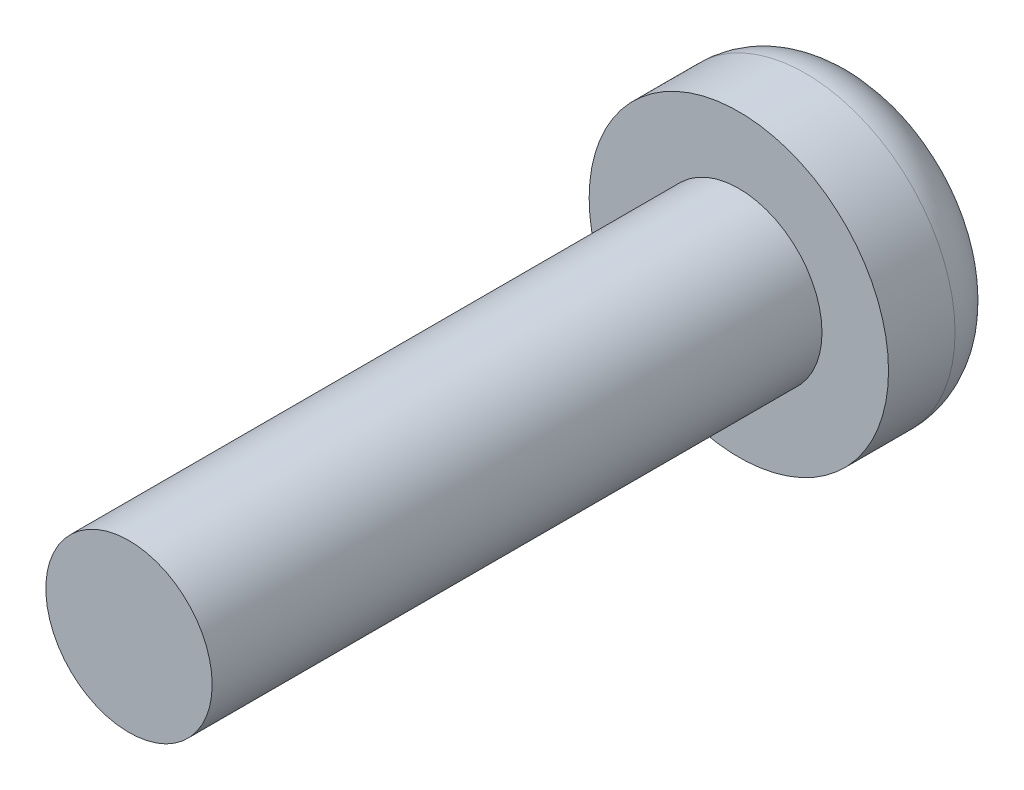
ISO-10303-21;
HEADER;
FILE_DESCRIPTION(('STEP AP214'),'2;1');
FILE_NAME('part.step','',(''),(''),'','','');
FILE_SCHEMA(('AUTOMOTIVE_DESIGN { 1 0 10303 214 1 1 1 1 }'));
ENDSEC;
DATA;
#1=APPLICATION_CONTEXT('core data for automotive mechanical design processes');
#2=APPLICATION_PROTOCOL_DEFINITION('international standard','automotive_design',2000,#1);
#3=PRODUCT_CONTEXT('',#1,'mechanical');
#4=PRODUCT('Part','Part','',(#3));
#5=PRODUCT_RELATED_PRODUCT_CATEGORY('part','',(#4));
#6=PRODUCT_DEFINITION_FORMATION('','',#4);
#7=PRODUCT_DEFINITION_CONTEXT('part definition',#1,'design');
#8=PRODUCT_DEFINITION('design','',#6,#7);
#9=PRODUCT_DEFINITION_SHAPE('','',#8);
#10=(LENGTH_UNIT() NAMED_UNIT(*) SI_UNIT(.MILLI.,.METRE.));
#11=(NAMED_UNIT(*) PLANE_ANGLE_UNIT() SI_UNIT($,.RADIAN.));
#12=(NAMED_UNIT(*) SI_UNIT($,.STERADIAN.) SOLID_ANGLE_UNIT());
#13=UNCERTAINTY_MEASURE_WITH_UNIT(LENGTH_MEASURE(1.E-05),#10,'distance_accuracy_value','');
#14=(GEOMETRIC_REPRESENTATION_CONTEXT(3) GLOBAL_UNCERTAINTY_ASSIGNED_CONTEXT((#13)) GLOBAL_UNIT_ASSIGNED_CONTEXT((#10,
#11,#12)) REPRESENTATION_CONTEXT('',''));
#15=CARTESIAN_POINT('',(0.,0.,0.));
#16=DIRECTION('',(0.,0.,1.));
#17=DIRECTION('',(1.,0.,0.));
#18=AXIS2_PLACEMENT_3D('',#15,#16,#17);
#19=CARTESIAN_POINT('',(0.,0.,11.));
#20=DIRECTION('',(0.,0.,-1.));
#21=DIRECTION('',(-1.,0.,0.));
#22=AXIS2_PLACEMENT_3D('',#19,#20,#21);
#23=CYLINDRICAL_SURFACE('',#22,1.5);
#24=CARTESIAN_POINT('',(0.,0.,11.));
#25=DIRECTION('',(0.,0.,1.));
#26=DIRECTION('',(1.,0.,0.));
#27=AXIS2_PLACEMENT_3D('',#24,#25,#26);
#28=CIRCLE('',#27,1.5);
#29=CARTESIAN_POINT('',(1.5,0.,11.));
#30=VERTEX_POINT('',#29);
#31=EDGE_CURVE('E50',#30,#30,#28,.T.);
#32=ORIENTED_EDGE('',*,*,#31,.F.);
#33=EDGE_LOOP('',(#32));
#34=FACE_BOUND('',#33,.T.);
#35=CARTESIAN_POINT('',(0.,0.,0.));
#36=DIRECTION('',(0.,0.,1.));
#37=DIRECTION('',(1.,0.,0.));
#38=AXIS2_PLACEMENT_3D('',#35,#36,#37);
#39=CIRCLE('',#38,1.5);
#40=CARTESIAN_POINT('',(1.5,0.,0.));
#41=VERTEX_POINT('',#40);
#42=EDGE_CURVE('E55',#41,#41,#39,.T.);
#43=ORIENTED_EDGE('',*,*,#42,.T.);
#44=EDGE_LOOP('',(#43));
#45=FACE_BOUND('',#44,.T.);
#46=ADVANCED_FACE('F37',(#34,#45),#23,.T.);
#47=CARTESIAN_POINT('',(0.,0.,11.));
#48=DIRECTION('',(0.,0.,1.));
#49=DIRECTION('',(1.,0.,0.));
#50=AXIS2_PLACEMENT_3D('',#47,#48,#49);
#51=PLANE('',#50);
#52=ORIENTED_EDGE('',*,*,#31,.T.);
#53=EDGE_LOOP('',(#52));
#54=FACE_BOUND('',#53,.T.);
#55=ADVANCED_FACE('F82',(#54),#51,.T.);
#56=CARTESIAN_POINT('',(0.,0.,-2.2));
#57=DIRECTION('',(0.,0.,1.));
#58=DIRECTION('',(1.,0.,0.));
#59=AXIS2_PLACEMENT_3D('',#56,#57,#58);
#60=CYLINDRICAL_SURFACE('',#59,2.7);
#61=CARTESIAN_POINT('',(0.,0.,-1.2));
#62=DIRECTION('',(0.,0.,-1.));
#63=DIRECTION('',(-1.,0.,0.));
#64=AXIS2_PLACEMENT_3D('',#61,#62,#63);
#65=CIRCLE('',#64,2.7);
#66=CARTESIAN_POINT('',(-2.7,0.,-1.2));
#67=VERTEX_POINT('',#66);
#68=EDGE_CURVE('E10',#67,#67,#65,.F.);
#69=ORIENTED_EDGE('',*,*,#68,.T.);
#70=EDGE_LOOP('',(#69));
#71=FACE_BOUND('',#70,.T.);
#72=CARTESIAN_POINT('',(0.,0.,0.));
#73=DIRECTION('',(0.,0.,-1.));
#74=DIRECTION('',(-1.,0.,0.));
#75=AXIS2_PLACEMENT_3D('',#72,#73,#74);
#76=CIRCLE('',#75,2.7);
#77=CARTESIAN_POINT('',(-2.7,0.,0.));
#78=VERTEX_POINT('',#77);
#79=EDGE_CURVE('E60',#78,#78,#76,.T.);
#80=ORIENTED_EDGE('',*,*,#79,.T.);
#81=EDGE_LOOP('',(#80));
#82=FACE_BOUND('',#81,.T.);
#83=ADVANCED_FACE('F66',(#71,#82),#60,.T.);
#84=CARTESIAN_POINT('',(0.,0.,-2.2));
#85=DIRECTION('',(0.,0.,-1.));
#86=DIRECTION('',(-1.,0.,0.));
#87=AXIS2_PLACEMENT_3D('',#84,#85,#86);
#88=PLANE('',#87);
#89=CARTESIAN_POINT('',(0.,0.,-2.2));
#90=DIRECTION('',(0.,0.,-1.));
#91=DIRECTION('',(-1.,0.,0.));
#92=AXIS2_PLACEMENT_3D('',#89,#90,#91);
#93=CIRCLE('',#92,1.7);
#94=CARTESIAN_POINT('',(-1.7,0.,-2.2));
#95=VERTEX_POINT('',#94);
#96=EDGE_CURVE('E45',#95,#95,#93,.T.);
#97=ORIENTED_EDGE('',*,*,#96,.T.);
#98=EDGE_LOOP('',(#97));
#99=FACE_BOUND('',#98,.T.);
#100=ADVANCED_FACE('F70',(#99),#88,.T.);
#101=CARTESIAN_POINT('',(0.,0.,0.));
#102=DIRECTION('',(0.,0.,-1.));
#103=DIRECTION('',(-1.,0.,0.));
#104=AXIS2_PLACEMENT_3D('',#101,#102,#103);
#105=PLANE('',#104);
#106=ORIENTED_EDGE('',*,*,#42,.F.);
#107=EDGE_LOOP('',(#106));
#108=FACE_BOUND('',#107,.T.);
#109=ORIENTED_EDGE('',*,*,#79,.F.);
#110=EDGE_LOOP('',(#109));
#111=FACE_BOUND('',#110,.T.);
#112=ADVANCED_FACE('F68',(#108,#111),#105,.F.);
#113=CARTESIAN_POINT('',(0.,0.,-1.2));
#114=DIRECTION('',(0.,0.,-1.));
#115=DIRECTION('',(-1.,0.,0.));
#116=AXIS2_PLACEMENT_3D('',#113,#114,#115);
#117=TOROIDAL_SURFACE('',#116,1.7,1.);
#118=ORIENTED_EDGE('',*,*,#68,.F.);
#119=EDGE_LOOP('',(#118));
#120=FACE_BOUND('',#119,.T.);
#121=ORIENTED_EDGE('',*,*,#96,.F.);
#122=EDGE_LOOP('',(#121));
#123=FACE_BOUND('',#122,.T.);
#124=ADVANCED_FACE('F39',(#120,#123),#117,.T.);
#125=CLOSED_SHELL('',(#46,#55,#83,#100,#112,#124));
#126=MANIFOLD_SOLID_BREP('B2',#125);
#127=ADVANCED_BREP_SHAPE_REPRESENTATION('',(#18,#126),#14);
#128=SHAPE_DEFINITION_REPRESENTATION(#9,#127);
ENDSEC;
END-ISO-10303-21;
